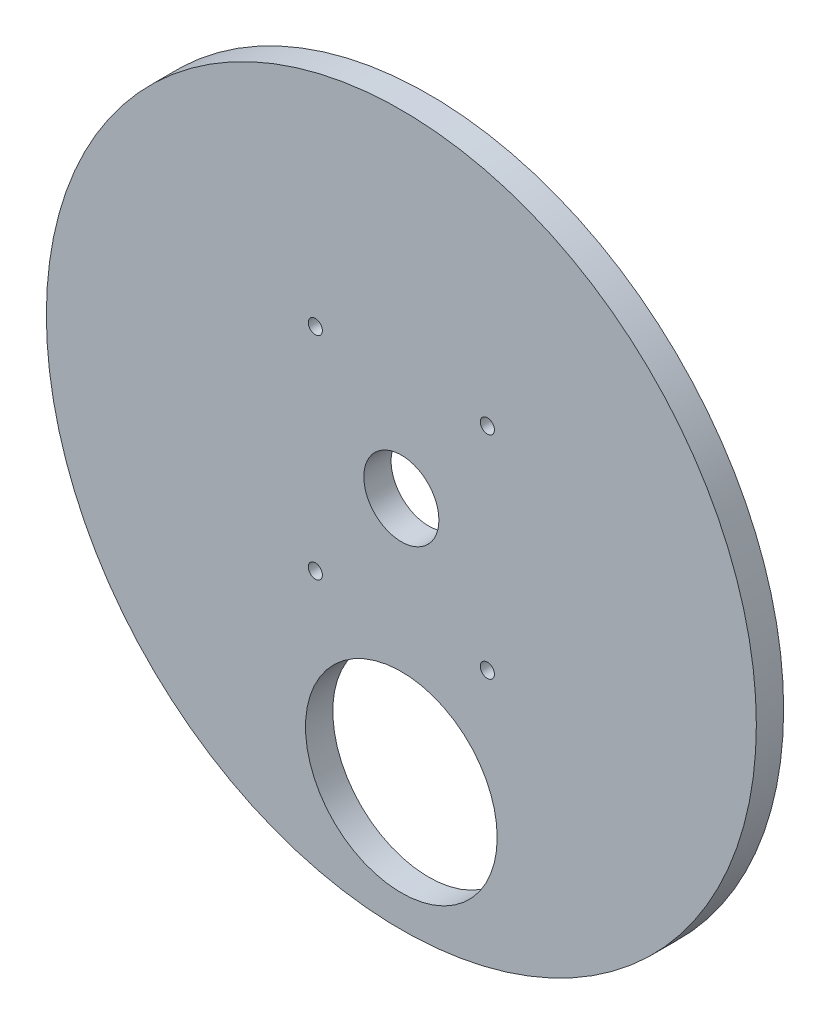
ISO-10303-21;
HEADER;
FILE_DESCRIPTION(('STEP AP214'),'2;1');
FILE_NAME('part.step','',(''),(''),'','','');
FILE_SCHEMA(('AUTOMOTIVE_DESIGN { 1 0 10303 214 1 1 1 1 }'));
ENDSEC;
DATA;
#1=APPLICATION_CONTEXT('core data for automotive mechanical design processes');
#2=APPLICATION_PROTOCOL_DEFINITION('international standard','automotive_design',2000,#1);
#3=PRODUCT_CONTEXT('',#1,'mechanical');
#4=PRODUCT('Part','Part','',(#3));
#5=PRODUCT_RELATED_PRODUCT_CATEGORY('part','',(#4));
#6=PRODUCT_DEFINITION_FORMATION('','',#4);
#7=PRODUCT_DEFINITION_CONTEXT('part definition',#1,'design');
#8=PRODUCT_DEFINITION('design','',#6,#7);
#9=PRODUCT_DEFINITION_SHAPE('','',#8);
#10=(LENGTH_UNIT() NAMED_UNIT(*) SI_UNIT(.MILLI.,.METRE.));
#11=(NAMED_UNIT(*) PLANE_ANGLE_UNIT() SI_UNIT($,.RADIAN.));
#12=(NAMED_UNIT(*) SI_UNIT($,.STERADIAN.) SOLID_ANGLE_UNIT());
#13=UNCERTAINTY_MEASURE_WITH_UNIT(LENGTH_MEASURE(1.E-05),#10,'distance_accuracy_value','');
#14=(GEOMETRIC_REPRESENTATION_CONTEXT(3) GLOBAL_UNCERTAINTY_ASSIGNED_CONTEXT((#13)) GLOBAL_UNIT_ASSIGNED_CONTEXT((#10,
#11,#12)) REPRESENTATION_CONTEXT('',''));
#15=CARTESIAN_POINT('',(0.,0.,0.));
#16=DIRECTION('',(0.,0.,1.));
#17=DIRECTION('',(1.,0.,0.));
#18=AXIS2_PLACEMENT_3D('',#15,#16,#17);
#19=CARTESIAN_POINT('',(0.,0.,12.7));
#20=DIRECTION('',(0.,0.,1.));
#21=DIRECTION('',(1.,0.,0.));
#22=AXIS2_PLACEMENT_3D('',#19,#20,#21);
#23=PLANE('',#22);
#24=CARTESIAN_POINT('',(40.005,49.2125,12.7));
#25=DIRECTION('',(0.,0.,1.));
#26=DIRECTION('',(1.,0.,0.));
#27=AXIS2_PLACEMENT_3D('',#24,#25,#26);
#28=CIRCLE('',#27,3.2893);
#29=CARTESIAN_POINT('',(43.2943,49.2125,12.7));
#30=VERTEX_POINT('',#29);
#31=EDGE_CURVE('E102',#30,#30,#28,.F.);
#32=ORIENTED_EDGE('',*,*,#31,.T.);
#33=EDGE_LOOP('',(#32));
#34=FACE_BOUND('',#33,.T.);
#35=CARTESIAN_POINT('',(-40.005,49.2125,12.7));
#36=DIRECTION('',(0.,0.,1.));
#37=DIRECTION('',(1.,0.,0.));
#38=AXIS2_PLACEMENT_3D('',#35,#36,#37);
#39=CIRCLE('',#38,3.2893);
#40=CARTESIAN_POINT('',(-36.7157,49.2125,12.7));
#41=VERTEX_POINT('',#40);
#42=EDGE_CURVE('E90',#41,#41,#39,.F.);
#43=ORIENTED_EDGE('',*,*,#42,.T.);
#44=EDGE_LOOP('',(#43));
#45=FACE_BOUND('',#44,.T.);
#46=CARTESIAN_POINT('',(-40.005,-49.2125,12.7));
#47=DIRECTION('',(0.,0.,1.));
#48=DIRECTION('',(1.,0.,0.));
#49=AXIS2_PLACEMENT_3D('',#46,#47,#48);
#50=CIRCLE('',#49,3.2893);
#51=CARTESIAN_POINT('',(-36.7157,-49.2125,12.7));
#52=VERTEX_POINT('',#51);
#53=EDGE_CURVE('E78',#52,#52,#50,.F.);
#54=ORIENTED_EDGE('',*,*,#53,.T.);
#55=EDGE_LOOP('',(#54));
#56=FACE_BOUND('',#55,.T.);
#57=CARTESIAN_POINT('',(0.,-114.3,12.7));
#58=DIRECTION('',(0.,0.,1.));
#59=DIRECTION('',(1.,0.,0.));
#60=AXIS2_PLACEMENT_3D('',#57,#58,#59);
#61=CIRCLE('',#60,44.577);
#62=CARTESIAN_POINT('',(44.577,-114.3,12.7));
#63=VERTEX_POINT('',#62);
#64=EDGE_CURVE('E10',#63,#63,#61,.T.);
#65=ORIENTED_EDGE('',*,*,#64,.F.);
#66=EDGE_LOOP('',(#65));
#67=FACE_BOUND('',#66,.T.);
#68=CARTESIAN_POINT('',(0.,0.,12.7));
#69=DIRECTION('',(0.,0.,1.));
#70=DIRECTION('',(1.,0.,0.));
#71=AXIS2_PLACEMENT_3D('',#68,#69,#70);
#72=CIRCLE('',#71,17.4625);
#73=CARTESIAN_POINT('',(17.4625,0.,12.7));
#74=VERTEX_POINT('',#73);
#75=EDGE_CURVE('E43',#74,#74,#72,.T.);
#76=ORIENTED_EDGE('',*,*,#75,.F.);
#77=EDGE_LOOP('',(#76));
#78=FACE_BOUND('',#77,.T.);
#79=CARTESIAN_POINT('',(0.,-8.64302550661053,12.7));
#80=DIRECTION('',(0.,0.,1.));
#81=DIRECTION('',(1.,0.,0.));
#82=AXIS2_PLACEMENT_3D('',#79,#80,#81);
#83=CIRCLE('',#82,165.1);
#84=CARTESIAN_POINT('',(165.1,-8.64302550661053,12.7));
#85=VERTEX_POINT('',#84);
#86=EDGE_CURVE('E48',#85,#85,#83,.T.);
#87=ORIENTED_EDGE('',*,*,#86,.T.);
#88=EDGE_LOOP('',(#87));
#89=FACE_BOUND('',#88,.T.);
#90=CARTESIAN_POINT('',(40.005,-49.2125,12.7));
#91=DIRECTION('',(0.,0.,1.));
#92=DIRECTION('',(1.,0.,0.));
#93=AXIS2_PLACEMENT_3D('',#90,#91,#92);
#94=CIRCLE('',#93,3.2893);
#95=CARTESIAN_POINT('',(43.2943,-49.2125,12.7));
#96=VERTEX_POINT('',#95);
#97=EDGE_CURVE('E66',#96,#96,#94,.F.);
#98=ORIENTED_EDGE('',*,*,#97,.T.);
#99=EDGE_LOOP('',(#98));
#100=FACE_BOUND('',#99,.T.);
#101=ADVANCED_FACE('F35',(#34,#45,#56,#67,#78,#89,#100),#23,.T.);
#102=CARTESIAN_POINT('',(0.,0.,0.));
#103=DIRECTION('',(0.,0.,1.));
#104=DIRECTION('',(1.,0.,0.));
#105=AXIS2_PLACEMENT_3D('',#102,#103,#104);
#106=PLANE('',#105);
#107=CARTESIAN_POINT('',(40.005,49.2125,0.));
#108=DIRECTION('',(0.,0.,-1.));
#109=DIRECTION('',(-1.,0.,0.));
#110=AXIS2_PLACEMENT_3D('',#107,#108,#109);
#111=CIRCLE('',#110,6.35);
#112=CARTESIAN_POINT('',(33.655,49.2125,0.));
#113=VERTEX_POINT('',#112);
#114=EDGE_CURVE('E106',#113,#113,#111,.T.);
#115=ORIENTED_EDGE('',*,*,#114,.F.);
#116=EDGE_LOOP('',(#115));
#117=FACE_BOUND('',#116,.T.);
#118=CARTESIAN_POINT('',(-40.005,49.2125,0.));
#119=DIRECTION('',(0.,0.,-1.));
#120=DIRECTION('',(-1.,0.,0.));
#121=AXIS2_PLACEMENT_3D('',#118,#119,#120);
#122=CIRCLE('',#121,6.35);
#123=CARTESIAN_POINT('',(-46.355,49.2125,0.));
#124=VERTEX_POINT('',#123);
#125=EDGE_CURVE('E94',#124,#124,#122,.T.);
#126=ORIENTED_EDGE('',*,*,#125,.F.);
#127=EDGE_LOOP('',(#126));
#128=FACE_BOUND('',#127,.T.);
#129=CARTESIAN_POINT('',(-40.005,-49.2125,0.));
#130=DIRECTION('',(0.,0.,-1.));
#131=DIRECTION('',(-1.,0.,0.));
#132=AXIS2_PLACEMENT_3D('',#129,#130,#131);
#133=CIRCLE('',#132,6.35);
#134=CARTESIAN_POINT('',(-46.355,-49.2125,0.));
#135=VERTEX_POINT('',#134);
#136=EDGE_CURVE('E82',#135,#135,#133,.T.);
#137=ORIENTED_EDGE('',*,*,#136,.F.);
#138=EDGE_LOOP('',(#137));
#139=FACE_BOUND('',#138,.T.);
#140=CARTESIAN_POINT('',(0.,-8.64302550661053,0.));
#141=DIRECTION('',(0.,0.,1.));
#142=DIRECTION('',(1.,0.,0.));
#143=AXIS2_PLACEMENT_3D('',#140,#141,#142);
#144=CIRCLE('',#143,165.1);
#145=CARTESIAN_POINT('',(165.1,-8.64302550661053,0.));
#146=VERTEX_POINT('',#145);
#147=EDGE_CURVE('E52',#146,#146,#144,.T.);
#148=ORIENTED_EDGE('',*,*,#147,.F.);
#149=EDGE_LOOP('',(#148));
#150=FACE_BOUND('',#149,.T.);
#151=CARTESIAN_POINT('',(0.,0.,0.));
#152=DIRECTION('',(0.,0.,1.));
#153=DIRECTION('',(1.,0.,0.));
#154=AXIS2_PLACEMENT_3D('',#151,#152,#153);
#155=CIRCLE('',#154,17.4625);
#156=CARTESIAN_POINT('',(17.4625,0.,0.));
#157=VERTEX_POINT('',#156);
#158=EDGE_CURVE('E54',#157,#157,#155,.T.);
#159=ORIENTED_EDGE('',*,*,#158,.T.);
#160=EDGE_LOOP('',(#159));
#161=FACE_BOUND('',#160,.T.);
#162=CARTESIAN_POINT('',(0.,-114.3,0.));
#163=DIRECTION('',(0.,0.,1.));
#164=DIRECTION('',(1.,0.,0.));
#165=AXIS2_PLACEMENT_3D('',#162,#163,#164);
#166=CIRCLE('',#165,44.577);
#167=CARTESIAN_POINT('',(44.577,-114.3,0.));
#168=VERTEX_POINT('',#167);
#169=EDGE_CURVE('E39',#168,#168,#166,.T.);
#170=ORIENTED_EDGE('',*,*,#169,.T.);
#171=EDGE_LOOP('',(#170));
#172=FACE_BOUND('',#171,.T.);
#173=CARTESIAN_POINT('',(40.005,-49.2125,0.));
#174=DIRECTION('',(0.,0.,-1.));
#175=DIRECTION('',(-1.,0.,0.));
#176=AXIS2_PLACEMENT_3D('',#173,#174,#175);
#177=CIRCLE('',#176,6.35);
#178=CARTESIAN_POINT('',(33.655,-49.2125,0.));
#179=VERTEX_POINT('',#178);
#180=EDGE_CURVE('E70',#179,#179,#177,.T.);
#181=ORIENTED_EDGE('',*,*,#180,.F.);
#182=EDGE_LOOP('',(#181));
#183=FACE_BOUND('',#182,.T.);
#184=ADVANCED_FACE('F128',(#117,#128,#139,#150,#161,#172,#183),#106,.F.);
#185=CARTESIAN_POINT('',(0.,0.,12.7));
#186=DIRECTION('',(0.,0.,-1.));
#187=DIRECTION('',(-1.,0.,0.));
#188=AXIS2_PLACEMENT_3D('',#185,#186,#187);
#189=CYLINDRICAL_SURFACE('',#188,17.4625);
#190=ORIENTED_EDGE('',*,*,#75,.T.);
#191=EDGE_LOOP('',(#190));
#192=FACE_BOUND('',#191,.T.);
#193=ORIENTED_EDGE('',*,*,#158,.F.);
#194=EDGE_LOOP('',(#193));
#195=FACE_BOUND('',#194,.T.);
#196=ADVANCED_FACE('F131',(#192,#195),#189,.F.);
#197=CARTESIAN_POINT('',(0.,-8.64302550661053,12.7));
#198=DIRECTION('',(0.,0.,-1.));
#199=DIRECTION('',(-1.,0.,0.));
#200=AXIS2_PLACEMENT_3D('',#197,#198,#199);
#201=CYLINDRICAL_SURFACE('',#200,165.1);
#202=ORIENTED_EDGE('',*,*,#86,.F.);
#203=EDGE_LOOP('',(#202));
#204=FACE_BOUND('',#203,.T.);
#205=ORIENTED_EDGE('',*,*,#147,.T.);
#206=EDGE_LOOP('',(#205));
#207=FACE_BOUND('',#206,.T.);
#208=ADVANCED_FACE('F37',(#204,#207),#201,.T.);
#209=CARTESIAN_POINT('',(0.,-114.3,12.7));
#210=DIRECTION('',(0.,0.,-1.));
#211=DIRECTION('',(-1.,0.,0.));
#212=AXIS2_PLACEMENT_3D('',#209,#210,#211);
#213=CYLINDRICAL_SURFACE('',#212,44.577);
#214=ORIENTED_EDGE('',*,*,#64,.T.);
#215=EDGE_LOOP('',(#214));
#216=FACE_BOUND('',#215,.T.);
#217=ORIENTED_EDGE('',*,*,#169,.F.);
#218=EDGE_LOOP('',(#217));
#219=FACE_BOUND('',#218,.T.);
#220=ADVANCED_FACE('F165',(#216,#219),#213,.F.);
#221=CARTESIAN_POINT('',(40.005,-49.2125,0.));
#222=DIRECTION('',(0.,0.,-1.));
#223=DIRECTION('',(-1.,0.,0.));
#224=AXIS2_PLACEMENT_3D('',#221,#222,#223);
#225=CYLINDRICAL_SURFACE('',#224,3.2893);
#226=ORIENTED_EDGE('',*,*,#97,.F.);
#227=EDGE_LOOP('',(#226));
#228=FACE_BOUND('',#227,.T.);
#229=CARTESIAN_POINT('',(40.005,-49.2125,3.81));
#230=DIRECTION('',(0.,0.,-1.));
#231=DIRECTION('',(-1.,0.,0.));
#232=AXIS2_PLACEMENT_3D('',#229,#230,#231);
#233=CIRCLE('',#232,3.2893);
#234=CARTESIAN_POINT('',(36.7157,-49.2125,3.81));
#235=VERTEX_POINT('',#234);
#236=EDGE_CURVE('E69',#235,#235,#233,.T.);
#237=ORIENTED_EDGE('',*,*,#236,.T.);
#238=EDGE_LOOP('',(#237));
#239=FACE_BOUND('',#238,.T.);
#240=ADVANCED_FACE('F154',(#228,#239),#225,.F.);
#241=CARTESIAN_POINT('',(43.2943,-49.2125,3.81));
#242=DIRECTION('',(0.,0.,1.));
#243=DIRECTION('',(1.,0.,0.));
#244=AXIS2_PLACEMENT_3D('',#241,#242,#243);
#245=PLANE('',#244);
#246=ORIENTED_EDGE('',*,*,#236,.F.);
#247=EDGE_LOOP('',(#246));
#248=FACE_BOUND('',#247,.T.);
#249=CARTESIAN_POINT('',(40.005,-49.2125,3.81));
#250=DIRECTION('',(0.,0.,-1.));
#251=DIRECTION('',(-1.,0.,0.));
#252=AXIS2_PLACEMENT_3D('',#249,#250,#251);
#253=CIRCLE('',#252,6.35);
#254=CARTESIAN_POINT('',(33.655,-49.2125,3.81));
#255=VERTEX_POINT('',#254);
#256=EDGE_CURVE('E55',#255,#255,#253,.T.);
#257=ORIENTED_EDGE('',*,*,#256,.T.);
#258=EDGE_LOOP('',(#257));
#259=FACE_BOUND('',#258,.T.);
#260=ADVANCED_FACE('F144',(#248,#259),#245,.F.);
#261=CARTESIAN_POINT('',(40.005,-49.2125,0.));
#262=DIRECTION('',(0.,0.,-1.));
#263=DIRECTION('',(-1.,0.,0.));
#264=AXIS2_PLACEMENT_3D('',#261,#262,#263);
#265=CYLINDRICAL_SURFACE('',#264,6.35);
#266=ORIENTED_EDGE('',*,*,#256,.F.);
#267=EDGE_LOOP('',(#266));
#268=FACE_BOUND('',#267,.T.);
#269=ORIENTED_EDGE('',*,*,#180,.T.);
#270=EDGE_LOOP('',(#269));
#271=FACE_BOUND('',#270,.T.);
#272=ADVANCED_FACE('F141',(#268,#271),#265,.F.);
#273=CARTESIAN_POINT('',(-40.005,-49.2125,0.));
#274=DIRECTION('',(0.,0.,-1.));
#275=DIRECTION('',(-1.,0.,0.));
#276=AXIS2_PLACEMENT_3D('',#273,#274,#275);
#277=CYLINDRICAL_SURFACE('',#276,3.2893);
#278=ORIENTED_EDGE('',*,*,#53,.F.);
#279=EDGE_LOOP('',(#278));
#280=FACE_BOUND('',#279,.T.);
#281=CARTESIAN_POINT('',(-40.005,-49.2125,3.81));
#282=DIRECTION('',(0.,0.,-1.));
#283=DIRECTION('',(-1.,0.,0.));
#284=AXIS2_PLACEMENT_3D('',#281,#282,#283);
#285=CIRCLE('',#284,3.2893);
#286=CARTESIAN_POINT('',(-43.2943,-49.2125,3.81));
#287=VERTEX_POINT('',#286);
#288=EDGE_CURVE('E81',#287,#287,#285,.T.);
#289=ORIENTED_EDGE('',*,*,#288,.T.);
#290=EDGE_LOOP('',(#289));
#291=FACE_BOUND('',#290,.T.);
#292=ADVANCED_FACE('F143',(#280,#291),#277,.F.);
#293=CARTESIAN_POINT('',(-36.7157,-49.2125,3.81));
#294=DIRECTION('',(0.,0.,1.));
#295=DIRECTION('',(1.,0.,0.));
#296=AXIS2_PLACEMENT_3D('',#293,#294,#295);
#297=PLANE('',#296);
#298=ORIENTED_EDGE('',*,*,#288,.F.);
#299=EDGE_LOOP('',(#298));
#300=FACE_BOUND('',#299,.T.);
#301=CARTESIAN_POINT('',(-40.005,-49.2125,3.81));
#302=DIRECTION('',(0.,0.,-1.));
#303=DIRECTION('',(-1.,0.,0.));
#304=AXIS2_PLACEMENT_3D('',#301,#302,#303);
#305=CIRCLE('',#304,6.35);
#306=CARTESIAN_POINT('',(-46.355,-49.2125,3.81));
#307=VERTEX_POINT('',#306);
#308=EDGE_CURVE('E73',#307,#307,#305,.T.);
#309=ORIENTED_EDGE('',*,*,#308,.T.);
#310=EDGE_LOOP('',(#309));
#311=FACE_BOUND('',#310,.T.);
#312=ADVANCED_FACE('F151',(#300,#311),#297,.F.);
#313=CARTESIAN_POINT('',(-40.005,-49.2125,0.));
#314=DIRECTION('',(0.,0.,-1.));
#315=DIRECTION('',(-1.,0.,0.));
#316=AXIS2_PLACEMENT_3D('',#313,#314,#315);
#317=CYLINDRICAL_SURFACE('',#316,6.35);
#318=ORIENTED_EDGE('',*,*,#308,.F.);
#319=EDGE_LOOP('',(#318));
#320=FACE_BOUND('',#319,.T.);
#321=ORIENTED_EDGE('',*,*,#136,.T.);
#322=EDGE_LOOP('',(#321));
#323=FACE_BOUND('',#322,.T.);
#324=ADVANCED_FACE('F187',(#320,#323),#317,.F.);
#325=CARTESIAN_POINT('',(-40.005,49.2125,0.));
#326=DIRECTION('',(0.,0.,-1.));
#327=DIRECTION('',(-1.,0.,0.));
#328=AXIS2_PLACEMENT_3D('',#325,#326,#327);
#329=CYLINDRICAL_SURFACE('',#328,3.2893);
#330=ORIENTED_EDGE('',*,*,#42,.F.);
#331=EDGE_LOOP('',(#330));
#332=FACE_BOUND('',#331,.T.);
#333=CARTESIAN_POINT('',(-40.005,49.2125,3.81));
#334=DIRECTION('',(0.,0.,-1.));
#335=DIRECTION('',(-1.,0.,0.));
#336=AXIS2_PLACEMENT_3D('',#333,#334,#335);
#337=CIRCLE('',#336,3.2893);
#338=CARTESIAN_POINT('',(-43.2943,49.2125,3.81));
#339=VERTEX_POINT('',#338);
#340=EDGE_CURVE('E93',#339,#339,#337,.T.);
#341=ORIENTED_EDGE('',*,*,#340,.T.);
#342=EDGE_LOOP('',(#341));
#343=FACE_BOUND('',#342,.T.);
#344=ADVANCED_FACE('F190',(#332,#343),#329,.F.);
#345=CARTESIAN_POINT('',(-36.7157,49.2125,3.81));
#346=DIRECTION('',(0.,0.,1.));
#347=DIRECTION('',(1.,0.,0.));
#348=AXIS2_PLACEMENT_3D('',#345,#346,#347);
#349=PLANE('',#348);
#350=ORIENTED_EDGE('',*,*,#340,.F.);
#351=EDGE_LOOP('',(#350));
#352=FACE_BOUND('',#351,.T.);
#353=CARTESIAN_POINT('',(-40.005,49.2125,3.81));
#354=DIRECTION('',(0.,0.,-1.));
#355=DIRECTION('',(-1.,0.,0.));
#356=AXIS2_PLACEMENT_3D('',#353,#354,#355);
#357=CIRCLE('',#356,6.35);
#358=CARTESIAN_POINT('',(-46.355,49.2125,3.81));
#359=VERTEX_POINT('',#358);
#360=EDGE_CURVE('E85',#359,#359,#357,.T.);
#361=ORIENTED_EDGE('',*,*,#360,.T.);
#362=EDGE_LOOP('',(#361));
#363=FACE_BOUND('',#362,.T.);
#364=ADVANCED_FACE('F198',(#352,#363),#349,.F.);
#365=CARTESIAN_POINT('',(-40.005,49.2125,0.));
#366=DIRECTION('',(0.,0.,-1.));
#367=DIRECTION('',(-1.,0.,0.));
#368=AXIS2_PLACEMENT_3D('',#365,#366,#367);
#369=CYLINDRICAL_SURFACE('',#368,6.35);
#370=ORIENTED_EDGE('',*,*,#360,.F.);
#371=EDGE_LOOP('',(#370));
#372=FACE_BOUND('',#371,.T.);
#373=ORIENTED_EDGE('',*,*,#125,.T.);
#374=EDGE_LOOP('',(#373));
#375=FACE_BOUND('',#374,.T.);
#376=ADVANCED_FACE('F195',(#372,#375),#369,.F.);
#377=CARTESIAN_POINT('',(40.005,49.2125,0.));
#378=DIRECTION('',(0.,0.,-1.));
#379=DIRECTION('',(-1.,0.,0.));
#380=AXIS2_PLACEMENT_3D('',#377,#378,#379);
#381=CYLINDRICAL_SURFACE('',#380,3.2893);
#382=ORIENTED_EDGE('',*,*,#31,.F.);
#383=EDGE_LOOP('',(#382));
#384=FACE_BOUND('',#383,.T.);
#385=CARTESIAN_POINT('',(40.005,49.2125,3.81));
#386=DIRECTION('',(0.,0.,-1.));
#387=DIRECTION('',(-1.,0.,0.));
#388=AXIS2_PLACEMENT_3D('',#385,#386,#387);
#389=CIRCLE('',#388,3.2893);
#390=CARTESIAN_POINT('',(36.7157,49.2125,3.81));
#391=VERTEX_POINT('',#390);
#392=EDGE_CURVE('E105',#391,#391,#389,.T.);
#393=ORIENTED_EDGE('',*,*,#392,.T.);
#394=EDGE_LOOP('',(#393));
#395=FACE_BOUND('',#394,.T.);
#396=ADVANCED_FACE('F114',(#384,#395),#381,.F.);
#397=CARTESIAN_POINT('',(43.2943,49.2125,3.81));
#398=DIRECTION('',(0.,0.,1.));
#399=DIRECTION('',(1.,0.,0.));
#400=AXIS2_PLACEMENT_3D('',#397,#398,#399);
#401=PLANE('',#400);
#402=ORIENTED_EDGE('',*,*,#392,.F.);
#403=EDGE_LOOP('',(#402));
#404=FACE_BOUND('',#403,.T.);
#405=CARTESIAN_POINT('',(40.005,49.2125,3.81));
#406=DIRECTION('',(0.,0.,-1.));
#407=DIRECTION('',(-1.,0.,0.));
#408=AXIS2_PLACEMENT_3D('',#405,#406,#407);
#409=CIRCLE('',#408,6.35);
#410=CARTESIAN_POINT('',(33.655,49.2125,3.81));
#411=VERTEX_POINT('',#410);
#412=EDGE_CURVE('E97',#411,#411,#409,.T.);
#413=ORIENTED_EDGE('',*,*,#412,.T.);
#414=EDGE_LOOP('',(#413));
#415=FACE_BOUND('',#414,.T.);
#416=ADVANCED_FACE('F116',(#404,#415),#401,.F.);
#417=CARTESIAN_POINT('',(40.005,49.2125,0.));
#418=DIRECTION('',(0.,0.,-1.));
#419=DIRECTION('',(-1.,0.,0.));
#420=AXIS2_PLACEMENT_3D('',#417,#418,#419);
#421=CYLINDRICAL_SURFACE('',#420,6.35);
#422=ORIENTED_EDGE('',*,*,#412,.F.);
#423=EDGE_LOOP('',(#422));
#424=FACE_BOUND('',#423,.T.);
#425=ORIENTED_EDGE('',*,*,#114,.T.);
#426=EDGE_LOOP('',(#425));
#427=FACE_BOUND('',#426,.T.);
#428=ADVANCED_FACE('F119',(#424,#427),#421,.F.);
#429=CLOSED_SHELL('',(#101,#184,#196,#208,#220,#240,#260,#272,#292,#312,#324,#344,#364,#376,
#396,#416,#428));
#430=MANIFOLD_SOLID_BREP('B2',#429);
#431=ADVANCED_BREP_SHAPE_REPRESENTATION('',(#18,#430),#14);
#432=SHAPE_DEFINITION_REPRESENTATION(#9,#431);
ENDSEC;
END-ISO-10303-21;
